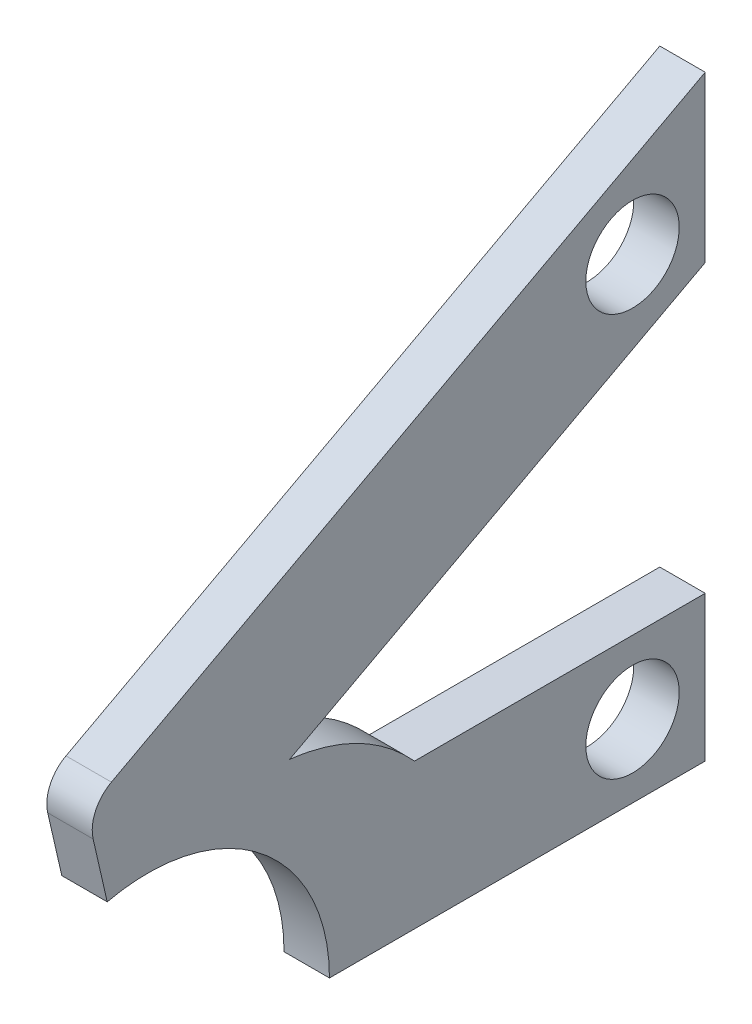
ISO-10303-21;
HEADER;
FILE_DESCRIPTION(('STEP AP214'),'2;1');
FILE_NAME('part.step','',(''),(''),'','','');
FILE_SCHEMA(('AUTOMOTIVE_DESIGN { 1 0 10303 214 1 1 1 1 }'));
ENDSEC;
DATA;
#1=APPLICATION_CONTEXT('core data for automotive mechanical design processes');
#2=APPLICATION_PROTOCOL_DEFINITION('international standard','automotive_design',2000,#1);
#3=PRODUCT_CONTEXT('',#1,'mechanical');
#4=PRODUCT('Part','Part','',(#3));
#5=PRODUCT_RELATED_PRODUCT_CATEGORY('part','',(#4));
#6=PRODUCT_DEFINITION_FORMATION('','',#4);
#7=PRODUCT_DEFINITION_CONTEXT('part definition',#1,'design');
#8=PRODUCT_DEFINITION('design','',#6,#7);
#9=PRODUCT_DEFINITION_SHAPE('','',#8);
#10=(LENGTH_UNIT() NAMED_UNIT(*) SI_UNIT(.MILLI.,.METRE.));
#11=(NAMED_UNIT(*) PLANE_ANGLE_UNIT() SI_UNIT($,.RADIAN.));
#12=(NAMED_UNIT(*) SI_UNIT($,.STERADIAN.) SOLID_ANGLE_UNIT());
#13=UNCERTAINTY_MEASURE_WITH_UNIT(LENGTH_MEASURE(1.E-05),#10,'distance_accuracy_value','');
#14=(GEOMETRIC_REPRESENTATION_CONTEXT(3) GLOBAL_UNCERTAINTY_ASSIGNED_CONTEXT((#13)) GLOBAL_UNIT_ASSIGNED_CONTEXT((#10,
#11,#12)) REPRESENTATION_CONTEXT('',''));
#15=CARTESIAN_POINT('',(0.,0.,0.));
#16=DIRECTION('',(0.,0.,1.));
#17=DIRECTION('',(1.,0.,0.));
#18=AXIS2_PLACEMENT_3D('',#15,#16,#17);
#19=CARTESIAN_POINT('',(-115.73,634.171411907699,4.44089209850063E-13));
#20=DIRECTION('',(0.,0.,-1.));
#21=DIRECTION('',(0.,1.,0.));
#22=AXIS2_PLACEMENT_3D('',#19,#20,#21);
#23=PLANE('',#22);
#24=DIRECTION('',(0.,1.,0.));
#25=VECTOR('',#24,1.);
#26=CARTESIAN_POINT('',(-112.555,634.171411907699,4.44089209850063E-13));
#27=LINE('',#26,#25);
#28=CARTESIAN_POINT('',(-112.555,634.171411907699,4.44089209850063E-13));
#29=VERTEX_POINT('',#28);
#30=CARTESIAN_POINT('',(-112.555,644.331411907699,3.33066907387547E-13));
#31=VERTEX_POINT('',#30);
#32=EDGE_CURVE('E162',#29,#31,#27,.T.);
#33=ORIENTED_EDGE('',*,*,#32,.F.);
#34=DIRECTION('',(1.,0.,0.));
#35=VECTOR('',#34,1.);
#36=CARTESIAN_POINT('',(-115.73,634.171411907699,4.44089209850063E-13));
#37=LINE('',#36,#35);
#38=CARTESIAN_POINT('',(-115.73,634.171411907699,4.44089209850063E-13));
#39=VERTEX_POINT('',#38);
#40=EDGE_CURVE('E12',#39,#29,#37,.T.);
#41=ORIENTED_EDGE('',*,*,#40,.F.);
#42=DIRECTION('',(0.,1.,0.));
#43=VECTOR('',#42,1.);
#44=CARTESIAN_POINT('',(-115.73,634.171411907699,4.44089209850063E-13));
#45=LINE('',#44,#43);
#46=CARTESIAN_POINT('',(-115.73,644.331411907699,3.33066907387547E-13));
#47=VERTEX_POINT('',#46);
#48=EDGE_CURVE('E191',#39,#47,#45,.T.);
#49=ORIENTED_EDGE('',*,*,#48,.T.);
#50=DIRECTION('',(1.,0.,0.));
#51=VECTOR('',#50,1.);
#52=CARTESIAN_POINT('',(-115.73,644.331411907699,3.33066907387547E-13));
#53=LINE('',#52,#51);
#54=EDGE_CURVE('E55',#47,#31,#53,.T.);
#55=ORIENTED_EDGE('',*,*,#54,.T.);
#56=EDGE_LOOP('',(#33,#41,#49,#55));
#57=FACE_BOUND('',#56,.T.);
#58=ADVANCED_FACE('F52',(#57),#23,.T.);
#59=CARTESIAN_POINT('',(-115.73,634.171411907699,4.44089209850063E-13));
#60=DIRECTION('',(0.,1.,0.));
#61=DIRECTION('',(0.,0.,1.));
#62=AXIS2_PLACEMENT_3D('',#59,#60,#61);
#63=PLANE('',#62);
#64=DIRECTION('',(0.,0.,1.));
#65=VECTOR('',#64,1.);
#66=CARTESIAN_POINT('',(-112.555,634.171411907699,4.44089209850063E-13));
#67=LINE('',#66,#65);
#68=CARTESIAN_POINT('',(-112.555,634.1714119077,26.2687598546462));
#69=VERTEX_POINT('',#68);
#70=EDGE_CURVE('E103',#29,#69,#67,.T.);
#71=ORIENTED_EDGE('',*,*,#70,.T.);
#72=DIRECTION('',(1.,0.,0.));
#73=VECTOR('',#72,1.);
#74=CARTESIAN_POINT('',(-115.73,634.1714119077,26.2687598546462));
#75=LINE('',#74,#73);
#76=CARTESIAN_POINT('',(-115.73,634.1714119077,26.2687598546462));
#77=VERTEX_POINT('',#76);
#78=EDGE_CURVE('E61',#77,#69,#75,.T.);
#79=ORIENTED_EDGE('',*,*,#78,.F.);
#80=DIRECTION('',(0.,0.,1.));
#81=VECTOR('',#80,1.);
#82=CARTESIAN_POINT('',(-115.73,634.171411907699,4.44089209850063E-13));
#83=LINE('',#82,#81);
#84=EDGE_CURVE('E140',#39,#77,#83,.T.);
#85=ORIENTED_EDGE('',*,*,#84,.F.);
#86=ORIENTED_EDGE('',*,*,#40,.T.);
#87=EDGE_LOOP('',(#71,#79,#85,#86));
#88=FACE_BOUND('',#87,.T.);
#89=ADVANCED_FACE('F254',(#88),#63,.F.);
#90=CARTESIAN_POINT('',(-115.73,634.1714119077,38.9687598546462));
#91=DIRECTION('',(1.,0.,0.));
#92=DIRECTION('',(0.,0.,-1.));
#93=AXIS2_PLACEMENT_3D('',#90,#91,#92);
#94=CYLINDRICAL_SURFACE('',#93,12.7000000000001);
#95=CARTESIAN_POINT('',(-112.555,634.1714119077,38.9687598546462));
#96=DIRECTION('',(1.,0.,0.));
#97=DIRECTION('',(0.,0.,-1.));
#98=AXIS2_PLACEMENT_3D('',#95,#96,#97);
#99=CIRCLE('',#98,12.7000000000001);
#100=CARTESIAN_POINT('',(-112.555,646.550348368886,41.8063525121487));
#101=VERTEX_POINT('',#100);
#102=EDGE_CURVE('E147',#69,#101,#99,.T.);
#103=ORIENTED_EDGE('',*,*,#102,.T.);
#104=DIRECTION('',(1.,0.,0.));
#105=VECTOR('',#104,1.);
#106=CARTESIAN_POINT('',(-115.73,646.550348368886,41.8063525121487));
#107=LINE('',#106,#105);
#108=CARTESIAN_POINT('',(-115.73,646.550348368886,41.8063525121487));
#109=VERTEX_POINT('',#108);
#110=EDGE_CURVE('E144',#109,#101,#107,.T.);
#111=ORIENTED_EDGE('',*,*,#110,.F.);
#112=CARTESIAN_POINT('',(-115.73,634.1714119077,38.9687598546462));
#113=DIRECTION('',(1.,0.,0.));
#114=DIRECTION('',(0.,0.,-1.));
#115=AXIS2_PLACEMENT_3D('',#112,#113,#114);
#116=CIRCLE('',#115,12.7000000000001);
#117=EDGE_CURVE('E133',#77,#109,#116,.T.);
#118=ORIENTED_EDGE('',*,*,#117,.F.);
#119=ORIENTED_EDGE('',*,*,#78,.T.);
#120=EDGE_LOOP('',(#103,#111,#118,#119));
#121=FACE_BOUND('',#120,.T.);
#122=ADVANCED_FACE('F145',(#121),#94,.F.);
#123=CARTESIAN_POINT('',(-115.73,646.550348368886,41.8063525121487));
#124=DIRECTION('',(0.,0.223432492716765,-0.974719406392615));
#125=DIRECTION('',(0.,0.974719406392615,0.223432492716765));
#126=AXIS2_PLACEMENT_3D('',#123,#124,#125);
#127=PLANE('',#126);
#128=DIRECTION('',(0.,0.974719406392615,0.223432492716765));
#129=VECTOR('',#128,1.);
#130=CARTESIAN_POINT('',(-112.555,646.550348368886,41.8063525121487));
#131=LINE('',#130,#129);
#132=CARTESIAN_POINT('',(-112.555,650.848642349992,42.7916396956494));
#133=VERTEX_POINT('',#132);
#134=EDGE_CURVE('E188',#101,#133,#131,.T.);
#135=ORIENTED_EDGE('',*,*,#134,.T.);
#136=DIRECTION('',(1.,0.,0.));
#137=VECTOR('',#136,1.);
#138=CARTESIAN_POINT('',(-115.73,650.848642349992,42.7916396956494));
#139=LINE('',#138,#137);
#140=CARTESIAN_POINT('',(-115.73,650.848642349992,42.7916396956494));
#141=VERTEX_POINT('',#140);
#142=EDGE_CURVE('E150',#141,#133,#139,.T.);
#143=ORIENTED_EDGE('',*,*,#142,.F.);
#144=DIRECTION('',(0.,0.974719406392615,0.223432492716765));
#145=VECTOR('',#144,1.);
#146=CARTESIAN_POINT('',(-115.73,646.550348368886,41.8063525121487));
#147=LINE('',#146,#145);
#148=EDGE_CURVE('E138',#109,#141,#147,.T.);
#149=ORIENTED_EDGE('',*,*,#148,.F.);
#150=ORIENTED_EDGE('',*,*,#110,.T.);
#151=EDGE_LOOP('',(#135,#143,#149,#150));
#152=FACE_BOUND('',#151,.T.);
#153=ADVANCED_FACE('F152',(#152),#127,.F.);
#154=CARTESIAN_POINT('',(-115.73,651.416160881493,40.3158524034122));
#155=DIRECTION('',(1.,0.,0.));
#156=DIRECTION('',(0.,0.,-1.));
#157=AXIS2_PLACEMENT_3D('',#154,#155,#156);
#158=CYLINDRICAL_SURFACE('',#157,2.53999999999996);
#159=CARTESIAN_POINT('',(-112.555,651.416160881493,40.3158524034122));
#160=DIRECTION('',(-1.,0.,0.));
#161=DIRECTION('',(0.,0.,1.));
#162=AXIS2_PLACEMENT_3D('',#159,#160,#161);
#163=CIRCLE('',#162,2.53999999999996);
#164=CARTESIAN_POINT('',(-112.555,653.655495883608,41.5145928875461));
#165=VERTEX_POINT('',#164);
#166=EDGE_CURVE('E186',#133,#165,#163,.T.);
#167=ORIENTED_EDGE('',*,*,#166,.T.);
#168=DIRECTION('',(1.,0.,0.));
#169=VECTOR('',#168,1.);
#170=CARTESIAN_POINT('',(-115.73,653.655495883608,41.5145928875461));
#171=LINE('',#170,#169);
#172=CARTESIAN_POINT('',(-115.73,653.655495883608,41.5145928875461));
#173=VERTEX_POINT('',#172);
#174=EDGE_CURVE('E195',#173,#165,#171,.T.);
#175=ORIENTED_EDGE('',*,*,#174,.F.);
#176=CARTESIAN_POINT('',(-115.73,651.416160881493,40.3158524034122));
#177=DIRECTION('',(-1.,0.,0.));
#178=DIRECTION('',(0.,0.,1.));
#179=AXIS2_PLACEMENT_3D('',#176,#177,#178);
#180=CIRCLE('',#179,2.53999999999996);
#181=EDGE_CURVE('E155',#141,#173,#180,.T.);
#182=ORIENTED_EDGE('',*,*,#181,.F.);
#183=ORIENTED_EDGE('',*,*,#142,.T.);
#184=EDGE_LOOP('',(#167,#175,#182,#183));
#185=FACE_BOUND('',#184,.T.);
#186=ADVANCED_FACE('F211',(#185),#158,.T.);
#187=CARTESIAN_POINT('',(-115.73,653.655495883608,41.5145928875461));
#188=DIRECTION('',(0.,-0.881627953588682,-0.471945072493645));
#189=DIRECTION('',(0.,0.471945072493645,-0.881627953588683));
#190=AXIS2_PLACEMENT_3D('',#187,#188,#189);
#191=PLANE('',#190);
#192=DIRECTION('',(0.,0.471945072493645,-0.881627953588682));
#193=VECTOR('',#192,1.);
#194=CARTESIAN_POINT('',(-112.555,653.655495883608,41.5145928875461));
#195=LINE('',#194,#193);
#196=CARTESIAN_POINT('',(-112.555,675.878710869142,0.));
#197=VERTEX_POINT('',#196);
#198=EDGE_CURVE('E183',#165,#197,#195,.T.);
#199=ORIENTED_EDGE('',*,*,#198,.T.);
#200=DIRECTION('',(1.,0.,0.));
#201=VECTOR('',#200,1.);
#202=CARTESIAN_POINT('',(-115.73,675.878710869142,0.));
#203=LINE('',#202,#201);
#204=CARTESIAN_POINT('',(-115.73,675.878710869142,0.));
#205=VERTEX_POINT('',#204);
#206=EDGE_CURVE('E198',#205,#197,#203,.T.);
#207=ORIENTED_EDGE('',*,*,#206,.F.);
#208=DIRECTION('',(0.,0.471945072493645,-0.881627953588682));
#209=VECTOR('',#208,1.);
#210=CARTESIAN_POINT('',(-115.73,653.655495883608,41.5145928875461));
#211=LINE('',#210,#209);
#212=EDGE_CURVE('E157',#173,#205,#211,.T.);
#213=ORIENTED_EDGE('',*,*,#212,.F.);
#214=ORIENTED_EDGE('',*,*,#174,.T.);
#215=EDGE_LOOP('',(#199,#207,#213,#214));
#216=FACE_BOUND('',#215,.T.);
#217=ADVANCED_FACE('F221',(#216),#191,.F.);
#218=CARTESIAN_POINT('',(-115.73,664.354575366582,0.));
#219=DIRECTION('',(0.,0.,-1.));
#220=DIRECTION('',(-1.,0.,0.));
#221=AXIS2_PLACEMENT_3D('',#218,#219,#220);
#222=PLANE('',#221);
#223=DIRECTION('',(0.,1.,0.));
#224=VECTOR('',#223,1.);
#225=CARTESIAN_POINT('',(-112.555,664.354575366582,0.));
#226=LINE('',#225,#224);
#227=CARTESIAN_POINT('',(-112.555,664.354575366582,0.));
#228=VERTEX_POINT('',#227);
#229=EDGE_CURVE('E180',#228,#197,#226,.T.);
#230=ORIENTED_EDGE('',*,*,#229,.F.);
#231=DIRECTION('',(1.,0.,0.));
#232=VECTOR('',#231,1.);
#233=CARTESIAN_POINT('',(-115.73,664.354575366582,0.));
#234=LINE('',#233,#232);
#235=CARTESIAN_POINT('',(-115.73,664.354575366582,0.));
#236=VERTEX_POINT('',#235);
#237=EDGE_CURVE('E200',#236,#228,#234,.T.);
#238=ORIENTED_EDGE('',*,*,#237,.F.);
#239=DIRECTION('',(0.,1.,0.));
#240=VECTOR('',#239,1.);
#241=CARTESIAN_POINT('',(-115.73,664.354575366582,0.));
#242=LINE('',#241,#240);
#243=EDGE_CURVE('E218',#236,#205,#242,.T.);
#244=ORIENTED_EDGE('',*,*,#243,.T.);
#245=ORIENTED_EDGE('',*,*,#206,.T.);
#246=EDGE_LOOP('',(#230,#238,#244,#245));
#247=FACE_BOUND('',#246,.T.);
#248=ADVANCED_FACE('F224',(#247),#222,.T.);
#249=CARTESIAN_POINT('',(-115.73,648.802265306435,29.0528540100161));
#250=DIRECTION('',(0.,-0.88162795358868,-0.471945072493649));
#251=DIRECTION('',(0.,0.471945072493649,-0.881627953588681));
#252=AXIS2_PLACEMENT_3D('',#249,#250,#251);
#253=PLANE('',#252);
#254=DIRECTION('',(0.,0.471945072493649,-0.88162795358868));
#255=VECTOR('',#254,1.);
#256=CARTESIAN_POINT('',(-112.555,648.802265306435,29.0528540100161));
#257=LINE('',#256,#255);
#258=CARTESIAN_POINT('',(-112.555,648.802265306435,29.0528540100161));
#259=VERTEX_POINT('',#258);
#260=EDGE_CURVE('E174',#259,#228,#257,.T.);
#261=ORIENTED_EDGE('',*,*,#260,.F.);
#262=DIRECTION('',(1.,0.,0.));
#263=VECTOR('',#262,1.);
#264=CARTESIAN_POINT('',(-115.73,648.802265306435,29.0528540100161));
#265=LINE('',#264,#263);
#266=CARTESIAN_POINT('',(-115.73,648.802265306435,29.0528540100161));
#267=VERTEX_POINT('',#266);
#268=EDGE_CURVE('E202',#267,#259,#265,.T.);
#269=ORIENTED_EDGE('',*,*,#268,.F.);
#270=DIRECTION('',(0.,0.471945072493649,-0.88162795358868));
#271=VECTOR('',#270,1.);
#272=CARTESIAN_POINT('',(-115.73,648.802265306435,29.0528540100161));
#273=LINE('',#272,#271);
#274=EDGE_CURVE('E225',#267,#236,#273,.T.);
#275=ORIENTED_EDGE('',*,*,#274,.T.);
#276=ORIENTED_EDGE('',*,*,#237,.T.);
#277=EDGE_LOOP('',(#261,#269,#275,#276));
#278=FACE_BOUND('',#277,.T.);
#279=ADVANCED_FACE('F244',(#278),#253,.T.);
#280=CARTESIAN_POINT('',(-115.73,644.3314119077,20.3200000000003));
#281=CARTESIAN_POINT('',(-115.73,648.195680882383,23.8570976277728));
#282=CARTESIAN_POINT('',(-115.73,648.802265306435,29.0528540100161));
#283=B_SPLINE_CURVE_WITH_KNOTS('',2,(#280,#281,#282),.UNSPECIFIED.,.F.,.F.,(3,3),(0.,1.),.UNSPECIFIED.);
#284=DIRECTION('',(1.,0.,0.));
#285=VECTOR('',#284,1.);
#286=SURFACE_OF_LINEAR_EXTRUSION('',#283,#285);
#287=CARTESIAN_POINT('',(-112.555,644.3314119077,20.3200000000003));
#288=CARTESIAN_POINT('',(-112.555,648.195680882383,23.8570976277728));
#289=CARTESIAN_POINT('',(-112.555,648.802265306435,29.0528540100161));
#290=B_SPLINE_CURVE_WITH_KNOTS('',2,(#287,#288,#289),.UNSPECIFIED.,.F.,.F.,(3,3),(0.,1.),.UNSPECIFIED.);
#291=CARTESIAN_POINT('',(-112.555,644.3314119077,20.3200000000003));
#292=VERTEX_POINT('',#291);
#293=EDGE_CURVE('E169',#292,#259,#290,.T.);
#294=ORIENTED_EDGE('',*,*,#293,.F.);
#295=DIRECTION('',(1.,0.,0.));
#296=VECTOR('',#295,1.);
#297=CARTESIAN_POINT('',(-115.73,644.3314119077,20.3200000000003));
#298=LINE('',#297,#296);
#299=CARTESIAN_POINT('',(-115.73,644.3314119077,20.3200000000003));
#300=VERTEX_POINT('',#299);
#301=EDGE_CURVE('E203',#300,#292,#298,.T.);
#302=ORIENTED_EDGE('',*,*,#301,.F.);
#303=EDGE_CURVE('E227',#300,#267,#283,.T.);
#304=ORIENTED_EDGE('',*,*,#303,.T.);
#305=ORIENTED_EDGE('',*,*,#268,.T.);
#306=EDGE_LOOP('',(#294,#302,#304,#305));
#307=FACE_BOUND('',#306,.T.);
#308=ADVANCED_FACE('F241',(#307),#286,.T.);
#309=CARTESIAN_POINT('',(-115.73,644.331411907699,3.33066907387547E-13));
#310=DIRECTION('',(0.,1.,0.));
#311=DIRECTION('',(0.,0.,1.));
#312=AXIS2_PLACEMENT_3D('',#309,#310,#311);
#313=PLANE('',#312);
#314=DIRECTION('',(0.,0.,1.));
#315=VECTOR('',#314,1.);
#316=CARTESIAN_POINT('',(-112.555,644.331411907699,3.33066907387547E-13));
#317=LINE('',#316,#315);
#318=EDGE_CURVE('E165',#31,#292,#317,.T.);
#319=ORIENTED_EDGE('',*,*,#318,.F.);
#320=ORIENTED_EDGE('',*,*,#54,.F.);
#321=DIRECTION('',(0.,0.,1.));
#322=VECTOR('',#321,1.);
#323=CARTESIAN_POINT('',(-115.73,644.331411907699,3.33066907387547E-13));
#324=LINE('',#323,#322);
#325=EDGE_CURVE('E235',#47,#300,#324,.T.);
#326=ORIENTED_EDGE('',*,*,#325,.T.);
#327=ORIENTED_EDGE('',*,*,#301,.T.);
#328=EDGE_LOOP('',(#319,#320,#326,#327));
#329=FACE_BOUND('',#328,.T.);
#330=ADVANCED_FACE('F205',(#329),#313,.T.);
#331=CARTESIAN_POINT('',(-115.73,647.381259744725,24.2717623163905));
#332=DIRECTION('',(-1.,0.,0.));
#333=DIRECTION('',(0.,0.,1.));
#334=AXIS2_PLACEMENT_3D('',#331,#332,#333);
#335=PLANE('',#334);
#336=CARTESIAN_POINT('',(-115.73,639.251411907699,5.08000000000044));
#337=DIRECTION('',(-1.,0.,0.));
#338=DIRECTION('',(0.,0.,1.));
#339=AXIS2_PLACEMENT_3D('',#336,#337,#338);
#340=CIRCLE('',#339,3.26390000000001);
#341=CARTESIAN_POINT('',(-115.73,639.251411907699,8.34390000000045));
#342=VERTEX_POINT('',#341);
#343=EDGE_CURVE('E289',#342,#342,#340,.T.);
#344=ORIENTED_EDGE('',*,*,#343,.F.);
#345=EDGE_LOOP('',(#344));
#346=FACE_BOUND('',#345,.T.);
#347=CARTESIAN_POINT('',(-115.73,667.397263635271,5.08));
#348=DIRECTION('',(-1.,0.,0.));
#349=DIRECTION('',(0.,0.,1.));
#350=AXIS2_PLACEMENT_3D('',#347,#348,#349);
#351=CIRCLE('',#350,3.26390000000001);
#352=CARTESIAN_POINT('',(-115.73,667.397263635271,8.34390000000001));
#353=VERTEX_POINT('',#352);
#354=EDGE_CURVE('E286',#353,#353,#351,.T.);
#355=ORIENTED_EDGE('',*,*,#354,.F.);
#356=EDGE_LOOP('',(#355));
#357=FACE_BOUND('',#356,.T.);
#358=ORIENTED_EDGE('',*,*,#48,.F.);
#359=ORIENTED_EDGE('',*,*,#84,.T.);
#360=ORIENTED_EDGE('',*,*,#117,.T.);
#361=ORIENTED_EDGE('',*,*,#148,.T.);
#362=ORIENTED_EDGE('',*,*,#181,.T.);
#363=ORIENTED_EDGE('',*,*,#212,.T.);
#364=ORIENTED_EDGE('',*,*,#243,.F.);
#365=ORIENTED_EDGE('',*,*,#274,.F.);
#366=ORIENTED_EDGE('',*,*,#303,.F.);
#367=ORIENTED_EDGE('',*,*,#325,.F.);
#368=EDGE_LOOP('',(#358,#359,#360,#361,#362,#363,#364,#365,#366,#367));
#369=FACE_BOUND('',#368,.T.);
#370=ADVANCED_FACE('F136',(#346,#357,#369),#335,.T.);
#371=CARTESIAN_POINT('',(-112.555,647.381259744725,24.2717623163905));
#372=DIRECTION('',(-1.,0.,0.));
#373=DIRECTION('',(0.,0.,1.));
#374=AXIS2_PLACEMENT_3D('',#371,#372,#373);
#375=PLANE('',#374);
#376=CARTESIAN_POINT('',(-112.555,639.251411907699,5.08000000000044));
#377=DIRECTION('',(-1.,0.,0.));
#378=DIRECTION('',(0.,0.,1.));
#379=AXIS2_PLACEMENT_3D('',#376,#377,#378);
#380=CIRCLE('',#379,3.26390000000001);
#381=CARTESIAN_POINT('',(-112.555,639.251411907699,8.34390000000045));
#382=VERTEX_POINT('',#381);
#383=EDGE_CURVE('E166',#382,#382,#380,.T.);
#384=ORIENTED_EDGE('',*,*,#383,.T.);
#385=EDGE_LOOP('',(#384));
#386=FACE_BOUND('',#385,.T.);
#387=CARTESIAN_POINT('',(-112.555,667.397263635271,5.08));
#388=DIRECTION('',(-1.,0.,0.));
#389=DIRECTION('',(0.,0.,1.));
#390=AXIS2_PLACEMENT_3D('',#387,#388,#389);
#391=CIRCLE('',#390,3.26390000000001);
#392=CARTESIAN_POINT('',(-112.555,667.397263635271,8.34390000000001));
#393=VERTEX_POINT('',#392);
#394=EDGE_CURVE('E281',#393,#393,#391,.T.);
#395=ORIENTED_EDGE('',*,*,#394,.T.);
#396=EDGE_LOOP('',(#395));
#397=FACE_BOUND('',#396,.T.);
#398=ORIENTED_EDGE('',*,*,#32,.T.);
#399=ORIENTED_EDGE('',*,*,#318,.T.);
#400=ORIENTED_EDGE('',*,*,#293,.T.);
#401=ORIENTED_EDGE('',*,*,#260,.T.);
#402=ORIENTED_EDGE('',*,*,#229,.T.);
#403=ORIENTED_EDGE('',*,*,#198,.F.);
#404=ORIENTED_EDGE('',*,*,#166,.F.);
#405=ORIENTED_EDGE('',*,*,#134,.F.);
#406=ORIENTED_EDGE('',*,*,#102,.F.);
#407=ORIENTED_EDGE('',*,*,#70,.F.);
#408=EDGE_LOOP('',(#398,#399,#400,#401,#402,#403,#404,#405,#406,#407));
#409=FACE_BOUND('',#408,.T.);
#410=ADVANCED_FACE('F207',(#386,#397,#409),#375,.F.);
#411=CARTESIAN_POINT('',(-112.555,667.397263635271,5.08));
#412=DIRECTION('',(-1.,0.,0.));
#413=DIRECTION('',(0.,0.,1.));
#414=AXIS2_PLACEMENT_3D('',#411,#412,#413);
#415=CYLINDRICAL_SURFACE('',#414,3.26390000000001);
#416=ORIENTED_EDGE('',*,*,#394,.F.);
#417=EDGE_LOOP('',(#416));
#418=FACE_BOUND('',#417,.T.);
#419=ORIENTED_EDGE('',*,*,#354,.T.);
#420=EDGE_LOOP('',(#419));
#421=FACE_BOUND('',#420,.T.);
#422=ADVANCED_FACE('F301',(#418,#421),#415,.F.);
#423=CARTESIAN_POINT('',(-112.555,639.251411907699,5.08000000000044));
#424=DIRECTION('',(-1.,0.,0.));
#425=DIRECTION('',(0.,0.,1.));
#426=AXIS2_PLACEMENT_3D('',#423,#424,#425);
#427=CYLINDRICAL_SURFACE('',#426,3.26390000000001);
#428=ORIENTED_EDGE('',*,*,#383,.F.);
#429=EDGE_LOOP('',(#428));
#430=FACE_BOUND('',#429,.T.);
#431=ORIENTED_EDGE('',*,*,#343,.T.);
#432=EDGE_LOOP('',(#431));
#433=FACE_BOUND('',#432,.T.);
#434=ADVANCED_FACE('F298',(#430,#433),#427,.F.);
#435=CLOSED_SHELL('',(#58,#89,#122,#153,#186,#217,#248,#279,#308,#330,#370,#410,#422,#434));
#436=MANIFOLD_SOLID_BREP('B2',#435);
#437=ADVANCED_BREP_SHAPE_REPRESENTATION('',(#18,#436),#14);
#438=SHAPE_DEFINITION_REPRESENTATION(#9,#437);
ENDSEC;
END-ISO-10303-21;
